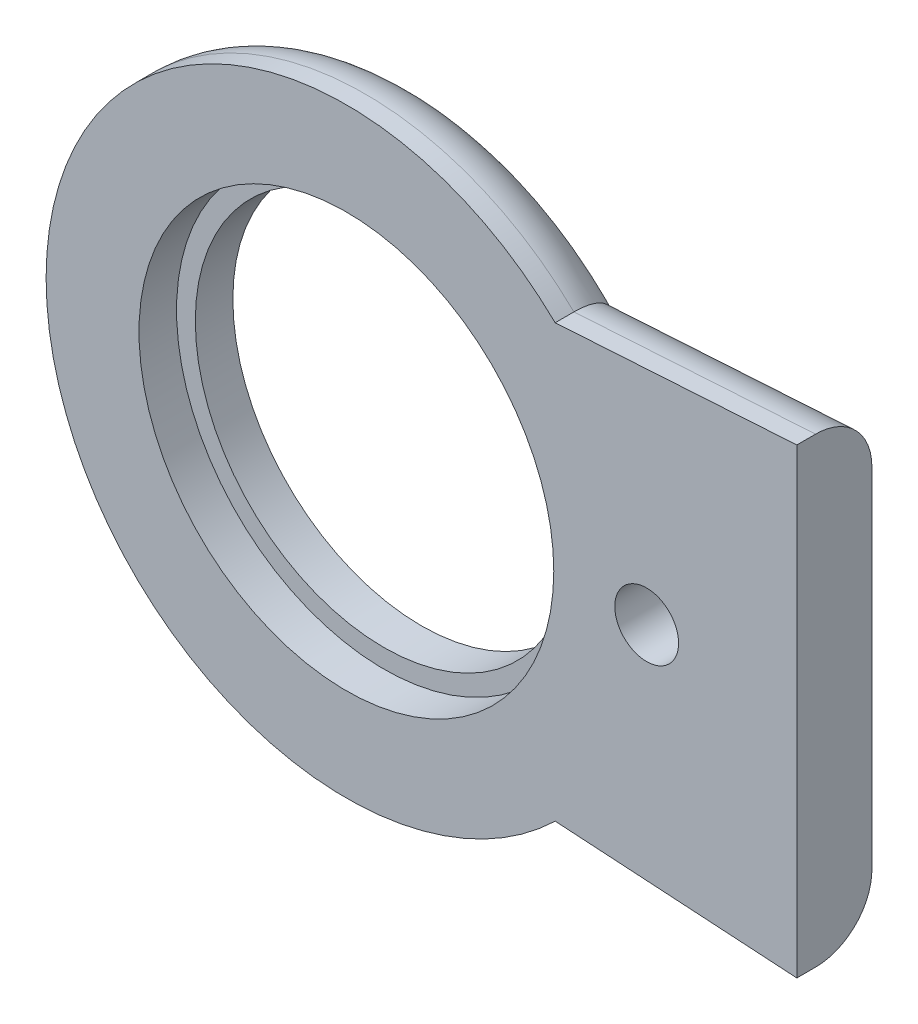
ISO-10303-21;
HEADER;
FILE_DESCRIPTION(('STEP AP214'),'2;1');
FILE_NAME('part.step','',(''),(''),'','','');
FILE_SCHEMA(('AUTOMOTIVE_DESIGN { 1 0 10303 214 1 1 1 1 }'));
ENDSEC;
DATA;
#1=APPLICATION_CONTEXT('core data for automotive mechanical design processes');
#2=APPLICATION_PROTOCOL_DEFINITION('international standard','automotive_design',2000,#1);
#3=PRODUCT_CONTEXT('',#1,'mechanical');
#4=PRODUCT('Part','Part','',(#3));
#5=PRODUCT_RELATED_PRODUCT_CATEGORY('part','',(#4));
#6=PRODUCT_DEFINITION_FORMATION('','',#4);
#7=PRODUCT_DEFINITION_CONTEXT('part definition',#1,'design');
#8=PRODUCT_DEFINITION('design','',#6,#7);
#9=PRODUCT_DEFINITION_SHAPE('','',#8);
#10=(LENGTH_UNIT() NAMED_UNIT(*) SI_UNIT(.MILLI.,.METRE.));
#11=(NAMED_UNIT(*) PLANE_ANGLE_UNIT() SI_UNIT($,.RADIAN.));
#12=(NAMED_UNIT(*) SI_UNIT($,.STERADIAN.) SOLID_ANGLE_UNIT());
#13=UNCERTAINTY_MEASURE_WITH_UNIT(LENGTH_MEASURE(1.E-05),#10,'distance_accuracy_value','');
#14=(GEOMETRIC_REPRESENTATION_CONTEXT(3) GLOBAL_UNCERTAINTY_ASSIGNED_CONTEXT((#13)) GLOBAL_UNIT_ASSIGNED_CONTEXT((#10,
#11,#12)) REPRESENTATION_CONTEXT('',''));
#15=CARTESIAN_POINT('',(0.,0.,0.));
#16=DIRECTION('',(0.,0.,1.));
#17=DIRECTION('',(1.,0.,0.));
#18=AXIS2_PLACEMENT_3D('',#15,#16,#17);
#19=CARTESIAN_POINT('',(-20.0212028963718,-21.01,4.));
#20=DIRECTION('',(0.,0.,1.));
#21=DIRECTION('',(1.,0.,0.));
#22=AXIS2_PLACEMENT_3D('',#19,#20,#21);
#23=PLANE('',#22);
#24=CARTESIAN_POINT('',(0.,0.,4.));
#25=DIRECTION('',(0.,0.,1.));
#26=DIRECTION('',(1.,0.,0.));
#27=AXIS2_PLACEMENT_3D('',#24,#25,#26);
#28=CIRCLE('',#27,16.);
#29=CARTESIAN_POINT('',(11.1242977306435,11.5,4.));
#30=VERTEX_POINT('',#29);
#31=CARTESIAN_POINT('',(11.1242977306435,-11.5,4.));
#32=VERTEX_POINT('',#31);
#33=EDGE_CURVE('E101',#30,#32,#28,.T.);
#34=ORIENTED_EDGE('',*,*,#33,.T.);
#35=DIRECTION('',(0.998083511417436,-0.0618813722911973,0.));
#36=VECTOR('',#35,1.);
#37=CARTESIAN_POINT('',(11.1242977306435,-11.5,4.));
#38=LINE('',#37,#36);
#39=CARTESIAN_POINT('',(24.,-12.2982960509077,4.));
#40=VERTEX_POINT('',#39);
#41=EDGE_CURVE('E115',#32,#40,#38,.T.);
#42=ORIENTED_EDGE('',*,*,#41,.T.);
#43=DIRECTION('',(0.,1.,0.));
#44=VECTOR('',#43,1.);
#45=CARTESIAN_POINT('',(24.,-21.01,4.));
#46=LINE('',#45,#44);
#47=CARTESIAN_POINT('',(24.,12.2982960509077,4.));
#48=VERTEX_POINT('',#47);
#49=EDGE_CURVE('E11',#40,#48,#46,.T.);
#50=ORIENTED_EDGE('',*,*,#49,.T.);
#51=DIRECTION('',(0.998083511417436,0.0618813722911973,0.));
#52=VECTOR('',#51,1.);
#53=CARTESIAN_POINT('',(11.1242977306435,11.5,4.));
#54=LINE('',#53,#52);
#55=EDGE_CURVE('E114',#30,#48,#54,.T.);
#56=ORIENTED_EDGE('',*,*,#55,.F.);
#57=EDGE_LOOP('',(#34,#42,#50,#56));
#58=FACE_BOUND('',#57,.T.);
#59=CARTESIAN_POINT('',(0.,0.,4.));
#60=DIRECTION('',(0.,0.,1.));
#61=DIRECTION('',(1.,0.,0.));
#62=AXIS2_PLACEMENT_3D('',#59,#60,#61);
#63=CIRCLE('',#62,11.05);
#64=CARTESIAN_POINT('',(11.05,0.,4.));
#65=VERTEX_POINT('',#64);
#66=EDGE_CURVE('E242',#65,#65,#63,.T.);
#67=ORIENTED_EDGE('',*,*,#66,.F.);
#68=EDGE_LOOP('',(#67));
#69=FACE_BOUND('',#68,.T.);
#70=CARTESIAN_POINT('',(16.,0.,4.));
#71=DIRECTION('',(0.,0.,-1.));
#72=DIRECTION('',(-1.,0.,0.));
#73=AXIS2_PLACEMENT_3D('',#70,#71,#72);
#74=CIRCLE('',#73,1.69999999999999);
#75=CARTESIAN_POINT('',(14.3,0.,4.));
#76=VERTEX_POINT('',#75);
#77=EDGE_CURVE('E165',#76,#76,#74,.T.);
#78=ORIENTED_EDGE('',*,*,#77,.T.);
#79=EDGE_LOOP('',(#78));
#80=FACE_BOUND('',#79,.T.);
#81=ADVANCED_FACE('F46',(#58,#69,#80),#23,.T.);
#82=CARTESIAN_POINT('',(24.,-21.01,4.));
#83=DIRECTION('',(1.,0.,0.));
#84=DIRECTION('',(0.,0.,-1.));
#85=AXIS2_PLACEMENT_3D('',#82,#83,#84);
#86=PLANE('',#85);
#87=ORIENTED_EDGE('',*,*,#49,.F.);
#88=DIRECTION('',(0.,0.,-1.));
#89=VECTOR('',#88,1.);
#90=CARTESIAN_POINT('',(24.,-12.2982960509077,11.));
#91=LINE('',#90,#89);
#92=CARTESIAN_POINT('',(24.,-12.2982960509077,3.));
#93=VERTEX_POINT('',#92);
#94=EDGE_CURVE('E123',#40,#93,#91,.T.);
#95=ORIENTED_EDGE('',*,*,#94,.T.);
#96=CARTESIAN_POINT('',(24.,-9.29253554521665,3.));
#97=DIRECTION('',(1.,0.,0.));
#98=DIRECTION('',(0.,-1.,0.));
#99=AXIS2_PLACEMENT_3D('',#96,#97,#98);
#100=ELLIPSE('',#99,3.00576050569108,3.);
#101=CARTESIAN_POINT('',(24.,-9.29253554521665,0.));
#102=VERTEX_POINT('',#101);
#103=EDGE_CURVE('E235',#102,#93,#100,.F.);
#104=ORIENTED_EDGE('',*,*,#103,.F.);
#105=DIRECTION('',(0.,1.,0.));
#106=VECTOR('',#105,1.);
#107=CARTESIAN_POINT('',(24.,0.,0.));
#108=LINE('',#107,#106);
#109=CARTESIAN_POINT('',(24.,9.29253554521665,0.));
#110=VERTEX_POINT('',#109);
#111=EDGE_CURVE('E117',#102,#110,#108,.T.);
#112=ORIENTED_EDGE('',*,*,#111,.T.);
#113=CARTESIAN_POINT('',(24.,9.29253554521665,3.));
#114=DIRECTION('',(1.,0.,0.));
#115=DIRECTION('',(0.,-1.,0.));
#116=AXIS2_PLACEMENT_3D('',#113,#114,#115);
#117=ELLIPSE('',#116,3.00576050569108,3.);
#118=CARTESIAN_POINT('',(24.,12.2982960509077,3.));
#119=VERTEX_POINT('',#118);
#120=EDGE_CURVE('E133',#119,#110,#117,.F.);
#121=ORIENTED_EDGE('',*,*,#120,.F.);
#122=DIRECTION('',(0.,0.,-1.));
#123=VECTOR('',#122,1.);
#124=CARTESIAN_POINT('',(24.,12.2982960509077,11.));
#125=LINE('',#124,#123);
#126=EDGE_CURVE('E146',#48,#119,#125,.T.);
#127=ORIENTED_EDGE('',*,*,#126,.F.);
#128=EDGE_LOOP('',(#87,#95,#104,#112,#121,#127));
#129=FACE_BOUND('',#128,.T.);
#130=ADVANCED_FACE('F205',(#129),#86,.T.);
#131=CARTESIAN_POINT('',(16.,0.,0.));
#132=DIRECTION('',(0.,0.,-1.));
#133=DIRECTION('',(-1.,0.,0.));
#134=AXIS2_PLACEMENT_3D('',#131,#132,#133);
#135=CONICAL_SURFACE('',#134,3.15,0.78539816339745);
#136=CARTESIAN_POINT('',(16.,0.,1.45000000000001));
#137=DIRECTION('',(0.,0.,-1.));
#138=DIRECTION('',(-1.,0.,0.));
#139=AXIS2_PLACEMENT_3D('',#136,#137,#138);
#140=CIRCLE('',#139,1.69999999999999);
#141=CARTESIAN_POINT('',(14.3,0.,1.45000000000001));
#142=VERTEX_POINT('',#141);
#143=EDGE_CURVE('E166',#142,#142,#140,.T.);
#144=ORIENTED_EDGE('',*,*,#143,.F.);
#145=EDGE_LOOP('',(#144));
#146=FACE_BOUND('',#145,.T.);
#147=CARTESIAN_POINT('',(16.,0.,0.));
#148=DIRECTION('',(0.,0.,-1.));
#149=DIRECTION('',(-1.,0.,0.));
#150=AXIS2_PLACEMENT_3D('',#147,#148,#149);
#151=CIRCLE('',#150,3.15);
#152=CARTESIAN_POINT('',(12.85,0.,0.));
#153=VERTEX_POINT('',#152);
#154=EDGE_CURVE('E60',#153,#153,#151,.T.);
#155=ORIENTED_EDGE('',*,*,#154,.T.);
#156=EDGE_LOOP('',(#155));
#157=FACE_BOUND('',#156,.T.);
#158=ADVANCED_FACE('F200',(#146,#157),#135,.F.);
#159=CARTESIAN_POINT('',(16.,0.,0.));
#160=DIRECTION('',(0.,0.,-1.));
#161=DIRECTION('',(-1.,0.,0.));
#162=AXIS2_PLACEMENT_3D('',#159,#160,#161);
#163=CYLINDRICAL_SURFACE('',#162,1.69999999999999);
#164=ORIENTED_EDGE('',*,*,#77,.F.);
#165=EDGE_LOOP('',(#164));
#166=FACE_BOUND('',#165,.T.);
#167=ORIENTED_EDGE('',*,*,#143,.T.);
#168=EDGE_LOOP('',(#167));
#169=FACE_BOUND('',#168,.T.);
#170=ADVANCED_FACE('F191',(#166,#169),#163,.F.);
#171=CARTESIAN_POINT('',(0.,0.,11.));
#172=DIRECTION('',(0.,0.,-1.));
#173=DIRECTION('',(-1.,0.,0.));
#174=AXIS2_PLACEMENT_3D('',#171,#172,#173);
#175=CYLINDRICAL_SURFACE('',#174,10.05);
#176=CARTESIAN_POINT('',(0.,0.,2.));
#177=DIRECTION('',(0.,0.,1.));
#178=DIRECTION('',(1.,0.,0.));
#179=AXIS2_PLACEMENT_3D('',#176,#177,#178);
#180=CIRCLE('',#179,10.05);
#181=CARTESIAN_POINT('',(10.05,0.,2.));
#182=VERTEX_POINT('',#181);
#183=EDGE_CURVE('E259',#182,#182,#180,.F.);
#184=ORIENTED_EDGE('',*,*,#183,.F.);
#185=EDGE_LOOP('',(#184));
#186=FACE_BOUND('',#185,.T.);
#187=CARTESIAN_POINT('',(0.,0.,0.));
#188=DIRECTION('',(0.,0.,1.));
#189=DIRECTION('',(1.,0.,0.));
#190=AXIS2_PLACEMENT_3D('',#187,#188,#189);
#191=CIRCLE('',#190,10.05);
#192=CARTESIAN_POINT('',(10.05,0.,0.));
#193=VERTEX_POINT('',#192);
#194=EDGE_CURVE('E169',#193,#193,#191,.T.);
#195=ORIENTED_EDGE('',*,*,#194,.F.);
#196=EDGE_LOOP('',(#195));
#197=FACE_BOUND('',#196,.T.);
#198=ADVANCED_FACE('F199',(#186,#197),#175,.F.);
#199=CARTESIAN_POINT('',(0.,0.,11.));
#200=DIRECTION('',(0.,0.,-1.));
#201=DIRECTION('',(-1.,0.,0.));
#202=AXIS2_PLACEMENT_3D('',#199,#200,#201);
#203=CYLINDRICAL_SURFACE('',#202,16.);
#204=ORIENTED_EDGE('',*,*,#33,.F.);
#205=DIRECTION('',(0.,0.,-1.));
#206=VECTOR('',#205,1.);
#207=CARTESIAN_POINT('',(11.1242977306435,11.5,11.));
#208=LINE('',#207,#206);
#209=CARTESIAN_POINT('',(11.1242977306435,11.5,3.));
#210=VERTEX_POINT('',#209);
#211=EDGE_CURVE('E75',#30,#210,#208,.T.);
#212=ORIENTED_EDGE('',*,*,#211,.T.);
#213=CARTESIAN_POINT('',(0.,0.,3.));
#214=DIRECTION('',(0.,0.,1.));
#215=DIRECTION('',(1.,0.,0.));
#216=AXIS2_PLACEMENT_3D('',#213,#214,#215);
#217=CIRCLE('',#216,16.);
#218=CARTESIAN_POINT('',(11.1242977306435,-11.5,3.));
#219=VERTEX_POINT('',#218);
#220=EDGE_CURVE('E107',#210,#219,#217,.T.);
#221=ORIENTED_EDGE('',*,*,#220,.T.);
#222=DIRECTION('',(0.,0.,-1.));
#223=VECTOR('',#222,1.);
#224=CARTESIAN_POINT('',(11.1242977306435,-11.5,11.));
#225=LINE('',#224,#223);
#226=EDGE_CURVE('E63',#32,#219,#225,.T.);
#227=ORIENTED_EDGE('',*,*,#226,.F.);
#228=EDGE_LOOP('',(#204,#212,#221,#227));
#229=FACE_BOUND('',#228,.T.);
#230=ADVANCED_FACE('F104',(#229),#203,.T.);
#231=CARTESIAN_POINT('',(11.1242977306435,-11.5,11.));
#232=DIRECTION('',(0.0618813722911973,0.998083511417436,0.));
#233=DIRECTION('',(-0.998083511417436,0.0618813722911973,0.));
#234=AXIS2_PLACEMENT_3D('',#231,#232,#233);
#235=PLANE('',#234);
#236=ORIENTED_EDGE('',*,*,#41,.F.);
#237=ORIENTED_EDGE('',*,*,#226,.T.);
#238=DIRECTION('',(0.998083511417436,-0.0618813722911973,0.));
#239=VECTOR('',#238,1.);
#240=CARTESIAN_POINT('',(11.1242977306435,-11.5,3.));
#241=LINE('',#240,#239);
#242=EDGE_CURVE('E137',#219,#93,#241,.T.);
#243=ORIENTED_EDGE('',*,*,#242,.T.);
#244=ORIENTED_EDGE('',*,*,#94,.F.);
#245=EDGE_LOOP('',(#236,#237,#243,#244));
#246=FACE_BOUND('',#245,.T.);
#247=ADVANCED_FACE('F116',(#246),#235,.F.);
#248=CARTESIAN_POINT('',(0.,0.,3.));
#249=DIRECTION('',(0.,0.,1.));
#250=DIRECTION('',(1.,0.,0.));
#251=AXIS2_PLACEMENT_3D('',#248,#249,#250);
#252=TOROIDAL_SURFACE('',#251,13.,3.);
#253=CARTESIAN_POINT('',(11.1242977306435,11.5,3.));
#254=CARTESIAN_POINT('',(11.1243010343133,11.5000116142998,2.92093554552732));
#255=CARTESIAN_POINT('',(11.1231154146311,11.4967953303828,2.84187692634271));
#256=CARTESIAN_POINT('',(11.118392021559,11.4839959780507,2.6843634175298));
#257=CARTESIAN_POINT('',(11.1148547349045,11.4744142271263,2.60590840636832));
#258=CARTESIAN_POINT('',(11.1054670337709,11.4490090194609,2.45038218840734));
#259=CARTESIAN_POINT('',(11.099623218585,11.4332033704404,2.37330768379517));
#260=CARTESIAN_POINT('',(11.0856769371985,11.3955353895136,2.22088286381723));
#261=CARTESIAN_POINT('',(11.0775744299889,11.3736729476403,2.14553257978327));
#262=CARTESIAN_POINT('',(11.0499725709891,11.2993241580403,1.92289970263547));
#263=CARTESIAN_POINT('',(11.0271674178851,11.2380451089233,1.77884695133912));
#264=CARTESIAN_POINT('',(10.9734614409216,11.0944920318124,1.50334541029614));
#265=CARTESIAN_POINT('',(10.9425574070153,11.012209679352,1.37190164649069));
#266=CARTESIAN_POINT('',(10.8723907297427,10.8266102741107,1.12042576018972));
#267=CARTESIAN_POINT('',(10.8328911370973,10.7227016016139,1.00089689378556));
#268=CARTESIAN_POINT('',(10.7472051487172,10.4990848029271,0.780519349670578));
#269=CARTESIAN_POINT('',(10.7010169017072,10.3793723033919,0.679675861341923));
#270=CARTESIAN_POINT('',(10.5990787058524,10.117539302017,0.490864780521302));
#271=CARTESIAN_POINT('',(10.5428590908829,9.97439181957967,0.404577147341478));
#272=CARTESIAN_POINT('',(10.4251422890187,9.67788543612932,0.256537644049369));
#273=CARTESIAN_POINT('',(10.3636418180806,9.52452019440517,0.194801178092816));
#274=CARTESIAN_POINT('',(10.2381774794491,9.21527066564697,0.097482118833536));
#275=CARTESIAN_POINT('',(10.1743046269406,9.05952875014734,0.0613226522306459));
#276=CARTESIAN_POINT('',(10.044035165297,8.74568242291214,0.0128953805009597));
#277=CARTESIAN_POINT('',(9.97764390486265,8.5875834082468,0.00057954640128351));
#278=CARTESIAN_POINT('',(9.90903040058856,8.42620517859025,6.6441824168273E-06));
#279=CARTESIAN_POINT('',(9.90743322632311,8.42244974741821,-1.43377572775898E-08));
#280=CARTESIAN_POINT('',(9.90583570640878,8.41869461125873,0.));
#281=B_SPLINE_CURVE_WITH_KNOTS('',3,(#253,#254,#255,#256,#257,#258,#259,#260,#261,#262,#263,
#264,#265,#266,#267,#268,#269,#270,#271,#272,#273,#274,#275,#276,#277,#278,#279,#280),
.UNSPECIFIED.,.F.,.F.,(4,2,2,2,2,2,2,2,2,2,2,2,2,4),(0.,0.237109112936542,0.474169165570084,
0.710555817297498,0.946946761138012,1.41916274766773,1.89156618405948,2.37916948446831,
2.86690800181488,3.3937410356843,3.92090410120622,4.43576152266746,4.94958076727388,
4.96182363528464),.UNSPECIFIED.);
#282=CARTESIAN_POINT('',(9.90583570640879,8.41869461125873,0.));
#283=VERTEX_POINT('',#282);
#284=EDGE_CURVE('E160',#283,#210,#281,.F.);
#285=ORIENTED_EDGE('',*,*,#284,.F.);
#286=CARTESIAN_POINT('',(0.,0.,0.));
#287=DIRECTION('',(0.,0.,1.));
#288=DIRECTION('',(1.,0.,0.));
#289=AXIS2_PLACEMENT_3D('',#286,#287,#288);
#290=CIRCLE('',#289,13.);
#291=CARTESIAN_POINT('',(9.90583570640879,-8.41869461125873,0.));
#292=VERTEX_POINT('',#291);
#293=EDGE_CURVE('E135',#292,#283,#290,.F.);
#294=ORIENTED_EDGE('',*,*,#293,.F.);
#295=CARTESIAN_POINT('',(11.1242977306435,-11.5,3.));
#296=CARTESIAN_POINT('',(11.1243010343133,-11.5000116142998,2.92093554552732));
#297=CARTESIAN_POINT('',(11.1231154146311,-11.4967953303828,2.84187692634271));
#298=CARTESIAN_POINT('',(11.118392021559,-11.4839959780507,2.6843634175298));
#299=CARTESIAN_POINT('',(11.1148547349045,-11.4744142271263,2.60590840636832));
#300=CARTESIAN_POINT('',(11.1054670337709,-11.4490090194609,2.45038218840734));
#301=CARTESIAN_POINT('',(11.099623218585,-11.4332033704404,2.37330768379517));
#302=CARTESIAN_POINT('',(11.0856769371985,-11.3955353895136,2.22088286381723));
#303=CARTESIAN_POINT('',(11.0775744299889,-11.3736729476403,2.14553257978327));
#304=CARTESIAN_POINT('',(11.0499725709891,-11.2993241580403,1.92289970263547));
#305=CARTESIAN_POINT('',(11.0271674178851,-11.2380451089233,1.77884695133912));
#306=CARTESIAN_POINT('',(10.9734614409216,-11.0944920318124,1.50334541029613));
#307=CARTESIAN_POINT('',(10.9425574070153,-11.012209679352,1.37190164649068));
#308=CARTESIAN_POINT('',(10.8723907297427,-10.8266102741107,1.12042576018972));
#309=CARTESIAN_POINT('',(10.8328911370973,-10.7227016016139,1.00089689378557));
#310=CARTESIAN_POINT('',(10.7472051487172,-10.4990848029271,0.780519349670581));
#311=CARTESIAN_POINT('',(10.7010169017072,-10.3793723033919,0.679675861341924));
#312=CARTESIAN_POINT('',(10.5990787058524,-10.117539302017,0.490864780521299));
#313=CARTESIAN_POINT('',(10.5428590908829,-9.97439181957964,0.404577147341471));
#314=CARTESIAN_POINT('',(10.4251422890186,-9.67788543612934,0.256537644049364));
#315=CARTESIAN_POINT('',(10.3636418180804,-9.52452019440526,0.194801178092813));
#316=CARTESIAN_POINT('',(10.2381774794493,-9.21527066564688,0.0974821188335382));
#317=CARTESIAN_POINT('',(10.1743046269414,-9.059528750147,0.0613226522306499));
#318=CARTESIAN_POINT('',(10.0440351652962,-8.74568242291252,0.0128953805009604));
#319=CARTESIAN_POINT('',(9.97764390485956,-8.58758340824813,0.000579546401281398));
#320=CARTESIAN_POINT('',(9.90903040058842,-8.42620517859032,6.64418241630941E-06));
#321=CARTESIAN_POINT('',(9.90743322632304,-8.42244974741824,-1.43377577558411E-08));
#322=CARTESIAN_POINT('',(9.90583570640879,-8.41869461125873,0.));
#323=B_SPLINE_CURVE_WITH_KNOTS('',3,(#295,#296,#297,#298,#299,#300,#301,#302,#303,#304,#305,
#306,#307,#308,#309,#310,#311,#312,#313,#314,#315,#316,#317,#318,#319,#320,#321,#322),
.UNSPECIFIED.,.F.,.F.,(4,2,2,2,2,2,2,2,2,2,2,2,2,4),(0.,0.237109112936541,0.474169165570084,
0.710555817297499,0.946946761138013,1.41916274766773,1.89156618405948,2.3791694844683,
2.86690800181488,3.39374103568432,3.92090410120622,4.43576152266743,4.94958076727387,
4.96182363528463),.UNSPECIFIED.);
#324=EDGE_CURVE('E158',#219,#292,#323,.T.);
#325=ORIENTED_EDGE('',*,*,#324,.F.);
#326=ORIENTED_EDGE('',*,*,#220,.F.);
#327=EDGE_LOOP('',(#285,#294,#325,#326));
#328=FACE_BOUND('',#327,.T.);
#329=ADVANCED_FACE('F153',(#328),#252,.T.);
#330=CARTESIAN_POINT('',(0.,0.,0.));
#331=DIRECTION('',(0.,0.,1.));
#332=DIRECTION('',(1.,0.,0.));
#333=AXIS2_PLACEMENT_3D('',#330,#331,#332);
#334=PLANE('',#333);
#335=ORIENTED_EDGE('',*,*,#194,.T.);
#336=EDGE_LOOP('',(#335));
#337=FACE_BOUND('',#336,.T.);
#338=ORIENTED_EDGE('',*,*,#154,.F.);
#339=EDGE_LOOP('',(#338));
#340=FACE_BOUND('',#339,.T.);
#341=ORIENTED_EDGE('',*,*,#111,.F.);
#342=DIRECTION('',(0.998083511417436,-0.0618813722911973,0.));
#343=VECTOR('',#342,1.);
#344=CARTESIAN_POINT('',(-0.48202950219566,-7.77464494313874,0.));
#345=LINE('',#344,#343);
#346=EDGE_CURVE('E132',#102,#292,#345,.F.);
#347=ORIENTED_EDGE('',*,*,#346,.T.);
#348=ORIENTED_EDGE('',*,*,#293,.T.);
#349=DIRECTION('',(0.998083511417436,0.0618813722911973,0.));
#350=VECTOR('',#349,1.);
#351=CARTESIAN_POINT('',(163.886135298759,17.9655032055138,0.));
#352=LINE('',#351,#350);
#353=EDGE_CURVE('E126',#283,#110,#352,.T.);
#354=ORIENTED_EDGE('',*,*,#353,.T.);
#355=EDGE_LOOP('',(#341,#347,#348,#354));
#356=FACE_BOUND('',#355,.T.);
#357=ADVANCED_FACE('F190',(#337,#340,#356),#334,.F.);
#358=CARTESIAN_POINT('',(11.1242977306435,11.5,11.));
#359=DIRECTION('',(-0.0618813722911973,0.998083511417436,0.));
#360=DIRECTION('',(-0.998083511417436,-0.0618813722911973,0.));
#361=AXIS2_PLACEMENT_3D('',#358,#359,#360);
#362=PLANE('',#361);
#363=ORIENTED_EDGE('',*,*,#211,.F.);
#364=ORIENTED_EDGE('',*,*,#55,.T.);
#365=ORIENTED_EDGE('',*,*,#126,.T.);
#366=DIRECTION('',(0.998083511417436,0.0618813722911973,0.));
#367=VECTOR('',#366,1.);
#368=CARTESIAN_POINT('',(11.1242977306435,11.5,3.));
#369=LINE('',#368,#367);
#370=EDGE_CURVE('E51',#119,#210,#369,.F.);
#371=ORIENTED_EDGE('',*,*,#370,.T.);
#372=EDGE_LOOP('',(#363,#364,#365,#371));
#373=FACE_BOUND('',#372,.T.);
#374=ADVANCED_FACE('F150',(#373),#362,.T.);
#375=CARTESIAN_POINT('',(-0.48202950219566,7.77464494313875,3.));
#376=DIRECTION('',(-0.998083511417436,-0.0618813722911973,0.));
#377=DIRECTION('',(0.0618813722911973,-0.998083511417436,0.));
#378=AXIS2_PLACEMENT_3D('',#375,#376,#377);
#379=CYLINDRICAL_SURFACE('',#378,3.);
#380=ORIENTED_EDGE('',*,*,#370,.F.);
#381=ORIENTED_EDGE('',*,*,#120,.T.);
#382=ORIENTED_EDGE('',*,*,#353,.F.);
#383=ORIENTED_EDGE('',*,*,#284,.T.);
#384=EDGE_LOOP('',(#380,#381,#382,#383));
#385=FACE_BOUND('',#384,.T.);
#386=ADVANCED_FACE('F162',(#385),#379,.T.);
#387=CARTESIAN_POINT('',(11.3099418475171,-8.50574946574769,3.));
#388=DIRECTION('',(0.998083511417436,-0.0618813722911973,0.));
#389=DIRECTION('',(0.0618813722911973,0.998083511417436,0.));
#390=AXIS2_PLACEMENT_3D('',#387,#388,#389);
#391=CYLINDRICAL_SURFACE('',#390,3.);
#392=ORIENTED_EDGE('',*,*,#346,.F.);
#393=ORIENTED_EDGE('',*,*,#103,.T.);
#394=ORIENTED_EDGE('',*,*,#242,.F.);
#395=ORIENTED_EDGE('',*,*,#324,.T.);
#396=EDGE_LOOP('',(#392,#393,#394,#395));
#397=FACE_BOUND('',#396,.T.);
#398=ADVANCED_FACE('F48',(#397),#391,.T.);
#399=CARTESIAN_POINT('',(0.,0.,2.));
#400=DIRECTION('',(0.,0.,1.));
#401=DIRECTION('',(1.,0.,0.));
#402=AXIS2_PLACEMENT_3D('',#399,#400,#401);
#403=PLANE('',#402);
#404=ORIENTED_EDGE('',*,*,#183,.T.);
#405=EDGE_LOOP('',(#404));
#406=FACE_BOUND('',#405,.T.);
#407=CARTESIAN_POINT('',(0.,0.,2.));
#408=DIRECTION('',(0.,0.,1.));
#409=DIRECTION('',(1.,0.,0.));
#410=AXIS2_PLACEMENT_3D('',#407,#408,#409);
#411=CIRCLE('',#410,11.05);
#412=CARTESIAN_POINT('',(11.05,0.,2.));
#413=VERTEX_POINT('',#412);
#414=EDGE_CURVE('E138',#413,#413,#411,.T.);
#415=ORIENTED_EDGE('',*,*,#414,.T.);
#416=EDGE_LOOP('',(#415));
#417=FACE_BOUND('',#416,.T.);
#418=ADVANCED_FACE('F187',(#406,#417),#403,.T.);
#419=CARTESIAN_POINT('',(0.,0.,42.2541197284454));
#420=DIRECTION('',(0.,0.,-1.));
#421=DIRECTION('',(-1.,0.,0.));
#422=AXIS2_PLACEMENT_3D('',#419,#420,#421);
#423=CYLINDRICAL_SURFACE('',#422,11.05);
#424=ORIENTED_EDGE('',*,*,#414,.F.);
#425=EDGE_LOOP('',(#424));
#426=FACE_BOUND('',#425,.T.);
#427=ORIENTED_EDGE('',*,*,#66,.T.);
#428=EDGE_LOOP('',(#427));
#429=FACE_BOUND('',#428,.T.);
#430=ADVANCED_FACE('F195',(#426,#429),#423,.F.);
#431=CLOSED_SHELL('',(#81,#130,#158,#170,#198,#230,#247,#329,#357,#374,#386,#398,#418,#430));
#432=MANIFOLD_SOLID_BREP('B2',#431);
#433=ADVANCED_BREP_SHAPE_REPRESENTATION('',(#18,#432),#14);
#434=SHAPE_DEFINITION_REPRESENTATION(#9,#433);
ENDSEC;
END-ISO-10303-21;
